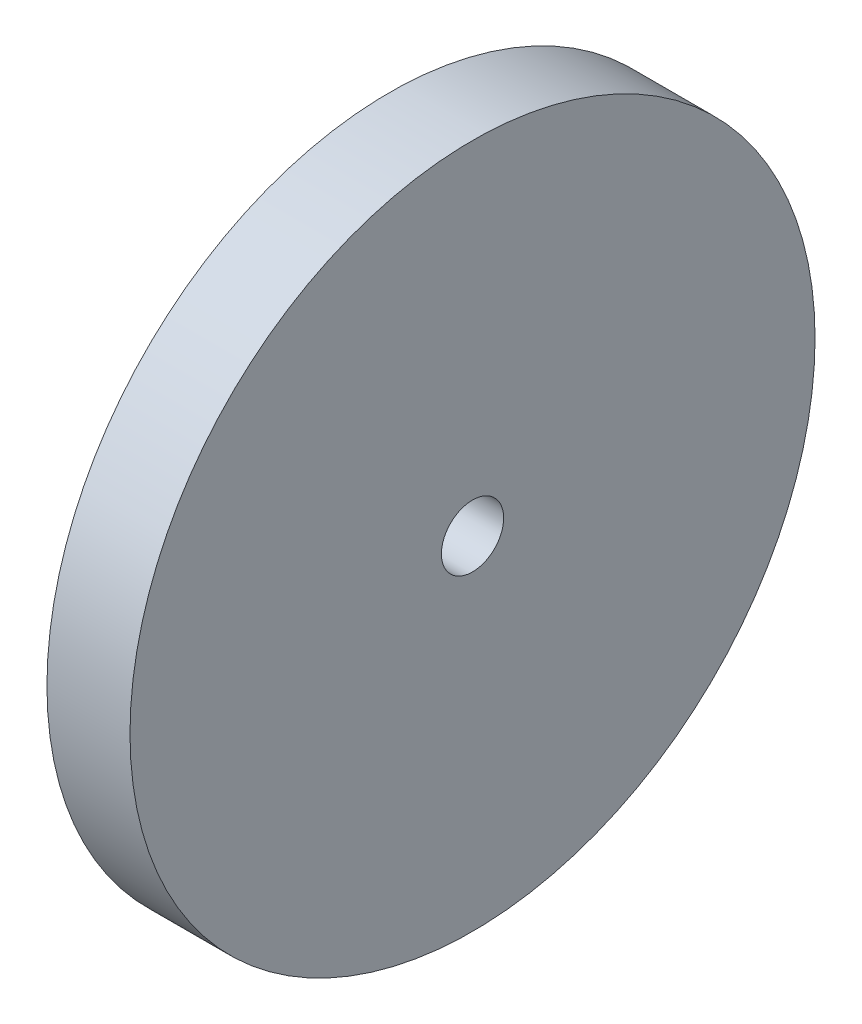
ISO-10303-21;
HEADER;
FILE_DESCRIPTION(('STEP AP214'),'2;1');
FILE_NAME('part.step','',(''),(''),'','','');
FILE_SCHEMA(('AUTOMOTIVE_DESIGN { 1 0 10303 214 1 1 1 1 }'));
ENDSEC;
DATA;
#1=APPLICATION_CONTEXT('core data for automotive mechanical design processes');
#2=APPLICATION_PROTOCOL_DEFINITION('international standard','automotive_design',2000,#1);
#3=PRODUCT_CONTEXT('',#1,'mechanical');
#4=PRODUCT('Part','Part','',(#3));
#5=PRODUCT_RELATED_PRODUCT_CATEGORY('part','',(#4));
#6=PRODUCT_DEFINITION_FORMATION('','',#4);
#7=PRODUCT_DEFINITION_CONTEXT('part definition',#1,'design');
#8=PRODUCT_DEFINITION('design','',#6,#7);
#9=PRODUCT_DEFINITION_SHAPE('','',#8);
#10=(LENGTH_UNIT() NAMED_UNIT(*) SI_UNIT(.MILLI.,.METRE.));
#11=(NAMED_UNIT(*) PLANE_ANGLE_UNIT() SI_UNIT($,.RADIAN.));
#12=(NAMED_UNIT(*) SI_UNIT($,.STERADIAN.) SOLID_ANGLE_UNIT());
#13=UNCERTAINTY_MEASURE_WITH_UNIT(LENGTH_MEASURE(1.E-05),#10,'distance_accuracy_value','');
#14=(GEOMETRIC_REPRESENTATION_CONTEXT(3) GLOBAL_UNCERTAINTY_ASSIGNED_CONTEXT((#13)) GLOBAL_UNIT_ASSIGNED_CONTEXT((#10,
#11,#12)) REPRESENTATION_CONTEXT('',''));
#15=CARTESIAN_POINT('',(0.,0.,0.));
#16=DIRECTION('',(0.,0.,1.));
#17=DIRECTION('',(1.,0.,0.));
#18=AXIS2_PLACEMENT_3D('',#15,#16,#17);
#19=CARTESIAN_POINT('',(4.,0.,0.));
#20=DIRECTION('',(1.,0.,0.));
#21=DIRECTION('',(0.,0.,-1.));
#22=AXIS2_PLACEMENT_3D('',#19,#20,#21);
#23=PLANE('',#22);
#24=CARTESIAN_POINT('',(4.,0.,0.));
#25=DIRECTION('',(1.,0.,0.));
#26=DIRECTION('',(0.,0.,-1.));
#27=AXIS2_PLACEMENT_3D('',#24,#25,#26);
#28=CIRCLE('',#27,16.5);
#29=CARTESIAN_POINT('',(4.,0.,-16.5));
#30=VERTEX_POINT('',#29);
#31=EDGE_CURVE('E10',#30,#30,#28,.T.);
#32=ORIENTED_EDGE('',*,*,#31,.T.);
#33=EDGE_LOOP('',(#32));
#34=FACE_BOUND('',#33,.T.);
#35=CARTESIAN_POINT('',(4.,0.,0.));
#36=DIRECTION('',(1.,0.,0.));
#37=DIRECTION('',(0.,0.,-1.));
#38=AXIS2_PLACEMENT_3D('',#35,#36,#37);
#39=CIRCLE('',#38,1.5);
#40=CARTESIAN_POINT('',(4.,0.,-1.5));
#41=VERTEX_POINT('',#40);
#42=EDGE_CURVE('E41',#41,#41,#39,.T.);
#43=ORIENTED_EDGE('',*,*,#42,.F.);
#44=EDGE_LOOP('',(#43));
#45=FACE_BOUND('',#44,.T.);
#46=ADVANCED_FACE('F30',(#34,#45),#23,.T.);
#47=CARTESIAN_POINT('',(0.,0.,0.));
#48=DIRECTION('',(1.,0.,0.));
#49=DIRECTION('',(0.,0.,-1.));
#50=AXIS2_PLACEMENT_3D('',#47,#48,#49);
#51=PLANE('',#50);
#52=CARTESIAN_POINT('',(0.,0.,0.));
#53=DIRECTION('',(1.,0.,0.));
#54=DIRECTION('',(0.,0.,-1.));
#55=AXIS2_PLACEMENT_3D('',#52,#53,#54);
#56=CIRCLE('',#55,16.5);
#57=CARTESIAN_POINT('',(0.,0.,-16.5));
#58=VERTEX_POINT('',#57);
#59=EDGE_CURVE('E34',#58,#58,#56,.T.);
#60=ORIENTED_EDGE('',*,*,#59,.F.);
#61=EDGE_LOOP('',(#60));
#62=FACE_BOUND('',#61,.T.);
#63=CARTESIAN_POINT('',(0.,0.,0.));
#64=DIRECTION('',(1.,0.,0.));
#65=DIRECTION('',(0.,0.,-1.));
#66=AXIS2_PLACEMENT_3D('',#63,#64,#65);
#67=CIRCLE('',#66,1.5);
#68=CARTESIAN_POINT('',(0.,0.,-1.5));
#69=VERTEX_POINT('',#68);
#70=EDGE_CURVE('E43',#69,#69,#67,.T.);
#71=ORIENTED_EDGE('',*,*,#70,.T.);
#72=EDGE_LOOP('',(#71));
#73=FACE_BOUND('',#72,.T.);
#74=ADVANCED_FACE('F53',(#62,#73),#51,.F.);
#75=CARTESIAN_POINT('',(4.,0.,0.));
#76=DIRECTION('',(-1.,0.,0.));
#77=DIRECTION('',(0.,0.,1.));
#78=AXIS2_PLACEMENT_3D('',#75,#76,#77);
#79=CYLINDRICAL_SURFACE('',#78,16.5);
#80=ORIENTED_EDGE('',*,*,#31,.F.);
#81=EDGE_LOOP('',(#80));
#82=FACE_BOUND('',#81,.T.);
#83=ORIENTED_EDGE('',*,*,#59,.T.);
#84=EDGE_LOOP('',(#83));
#85=FACE_BOUND('',#84,.T.);
#86=ADVANCED_FACE('F32',(#82,#85),#79,.T.);
#87=CARTESIAN_POINT('',(4.,0.,0.));
#88=DIRECTION('',(-1.,0.,0.));
#89=DIRECTION('',(0.,0.,1.));
#90=AXIS2_PLACEMENT_3D('',#87,#88,#89);
#91=CYLINDRICAL_SURFACE('',#90,1.5);
#92=ORIENTED_EDGE('',*,*,#42,.T.);
#93=EDGE_LOOP('',(#92));
#94=FACE_BOUND('',#93,.T.);
#95=ORIENTED_EDGE('',*,*,#70,.F.);
#96=EDGE_LOOP('',(#95));
#97=FACE_BOUND('',#96,.T.);
#98=ADVANCED_FACE('F49',(#94,#97),#91,.F.);
#99=CLOSED_SHELL('',(#46,#74,#86,#98));
#100=MANIFOLD_SOLID_BREP('B2',#99);
#101=ADVANCED_BREP_SHAPE_REPRESENTATION('',(#18,#100),#14);
#102=SHAPE_DEFINITION_REPRESENTATION(#9,#101);
ENDSEC;
END-ISO-10303-21;
